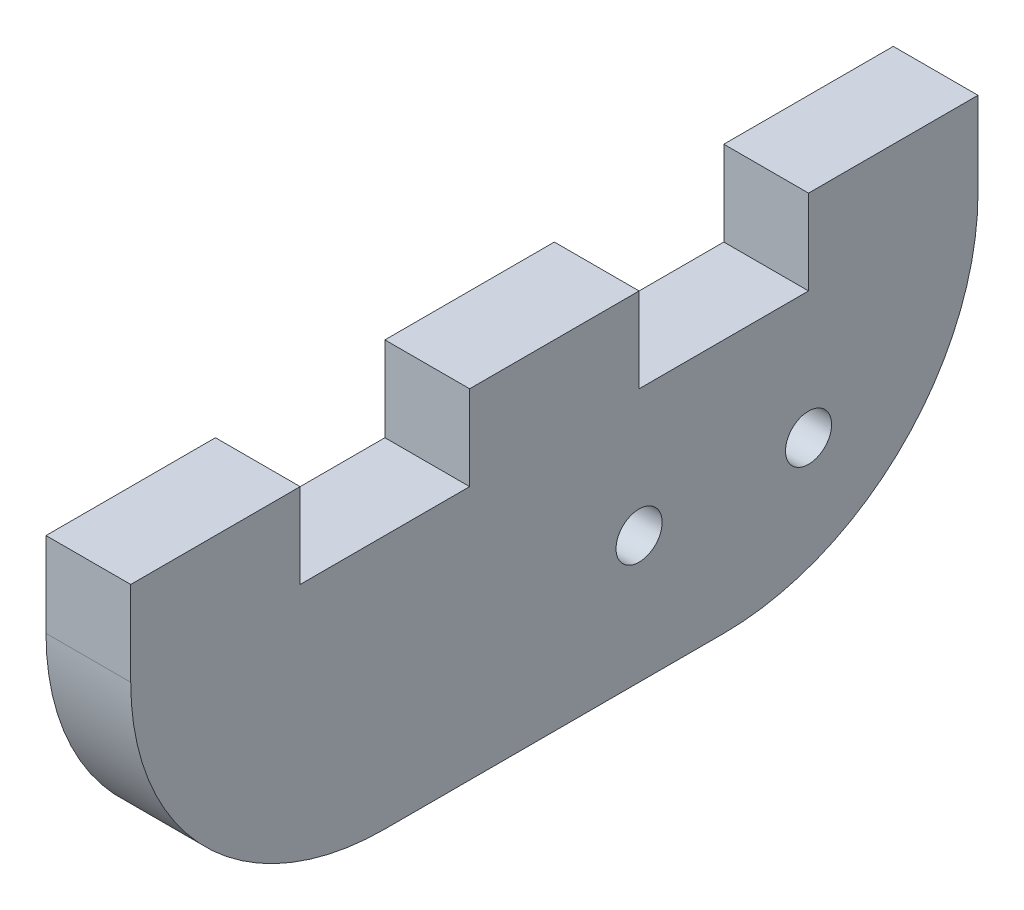
ISO-10303-21;
HEADER;
FILE_DESCRIPTION(('STEP AP214'),'2;1');
FILE_NAME('part.step','',(''),(''),'','','');
FILE_SCHEMA(('AUTOMOTIVE_DESIGN { 1 0 10303 214 1 1 1 1 }'));
ENDSEC;
DATA;
#1=APPLICATION_CONTEXT('core data for automotive mechanical design processes');
#2=APPLICATION_PROTOCOL_DEFINITION('international standard','automotive_design',2000,#1);
#3=PRODUCT_CONTEXT('',#1,'mechanical');
#4=PRODUCT('Part','Part','',(#3));
#5=PRODUCT_RELATED_PRODUCT_CATEGORY('part','',(#4));
#6=PRODUCT_DEFINITION_FORMATION('','',#4);
#7=PRODUCT_DEFINITION_CONTEXT('part definition',#1,'design');
#8=PRODUCT_DEFINITION('design','',#6,#7);
#9=PRODUCT_DEFINITION_SHAPE('','',#8);
#10=(LENGTH_UNIT() NAMED_UNIT(*) SI_UNIT(.MILLI.,.METRE.));
#11=(NAMED_UNIT(*) PLANE_ANGLE_UNIT() SI_UNIT($,.RADIAN.));
#12=(NAMED_UNIT(*) SI_UNIT($,.STERADIAN.) SOLID_ANGLE_UNIT());
#13=UNCERTAINTY_MEASURE_WITH_UNIT(LENGTH_MEASURE(1.E-05),#10,'distance_accuracy_value','');
#14=(GEOMETRIC_REPRESENTATION_CONTEXT(3) GLOBAL_UNCERTAINTY_ASSIGNED_CONTEXT((#13)) GLOBAL_UNIT_ASSIGNED_CONTEXT((#10,
#11,#12)) REPRESENTATION_CONTEXT('',''));
#15=CARTESIAN_POINT('',(0.,0.,0.));
#16=DIRECTION('',(0.,0.,1.));
#17=DIRECTION('',(1.,0.,0.));
#18=AXIS2_PLACEMENT_3D('',#15,#16,#17);
#19=CARTESIAN_POINT('',(3.175,0.,0.));
#20=DIRECTION('',(0.,0.,1.));
#21=DIRECTION('',(1.,0.,0.));
#22=AXIS2_PLACEMENT_3D('',#19,#20,#21);
#23=PLANE('',#22);
#24=DIRECTION('',(0.,1.,0.));
#25=VECTOR('',#24,1.);
#26=CARTESIAN_POINT('',(3.175,-19.05,0.));
#27=LINE('',#26,#25);
#28=CARTESIAN_POINT('',(3.175,0.,0.));
#29=VERTEX_POINT('',#28);
#30=CARTESIAN_POINT('',(3.175,6.35,0.));
#31=VERTEX_POINT('',#30);
#32=EDGE_CURVE('E137',#29,#31,#27,.T.);
#33=ORIENTED_EDGE('',*,*,#32,.F.);
#34=DIRECTION('',(-1.,0.,0.));
#35=VECTOR('',#34,1.);
#36=CARTESIAN_POINT('',(3.175,0.,0.));
#37=LINE('',#36,#35);
#38=CARTESIAN_POINT('',(-3.175,0.,0.));
#39=VERTEX_POINT('',#38);
#40=EDGE_CURVE('E155',#29,#39,#37,.T.);
#41=ORIENTED_EDGE('',*,*,#40,.T.);
#42=DIRECTION('',(0.,1.,0.));
#43=VECTOR('',#42,1.);
#44=CARTESIAN_POINT('',(-3.175,0.,0.));
#45=LINE('',#44,#43);
#46=CARTESIAN_POINT('',(-3.175,6.35,0.));
#47=VERTEX_POINT('',#46);
#48=EDGE_CURVE('E152',#39,#47,#45,.T.);
#49=ORIENTED_EDGE('',*,*,#48,.T.);
#50=DIRECTION('',(-1.,0.,0.));
#51=VECTOR('',#50,1.);
#52=CARTESIAN_POINT('',(3.175,6.35,0.));
#53=LINE('',#52,#51);
#54=EDGE_CURVE('E150',#31,#47,#53,.T.);
#55=ORIENTED_EDGE('',*,*,#54,.F.);
#56=EDGE_LOOP('',(#33,#41,#49,#55));
#57=FACE_BOUND('',#56,.T.);
#58=ADVANCED_FACE('F35',(#57),#23,.F.);
#59=CARTESIAN_POINT('',(3.175,6.35,0.));
#60=DIRECTION('',(0.,-1.,0.));
#61=DIRECTION('',(0.,0.,-1.));
#62=AXIS2_PLACEMENT_3D('',#59,#60,#61);
#63=PLANE('',#62);
#64=DIRECTION('',(0.,0.,1.));
#65=VECTOR('',#64,1.);
#66=CARTESIAN_POINT('',(-3.175,6.35,0.));
#67=LINE('',#66,#65);
#68=CARTESIAN_POINT('',(-3.175,6.35,12.7));
#69=VERTEX_POINT('',#68);
#70=EDGE_CURVE('E186',#47,#69,#67,.T.);
#71=ORIENTED_EDGE('',*,*,#70,.T.);
#72=DIRECTION('',(-1.,0.,0.));
#73=VECTOR('',#72,1.);
#74=CARTESIAN_POINT('',(3.175,6.35,12.7));
#75=LINE('',#74,#73);
#76=CARTESIAN_POINT('',(3.175,6.35,12.7));
#77=VERTEX_POINT('',#76);
#78=EDGE_CURVE('E156',#77,#69,#75,.T.);
#79=ORIENTED_EDGE('',*,*,#78,.F.);
#80=DIRECTION('',(0.,0.,1.));
#81=VECTOR('',#80,1.);
#82=CARTESIAN_POINT('',(3.175,6.35,0.));
#83=LINE('',#82,#81);
#84=EDGE_CURVE('E141',#31,#77,#83,.T.);
#85=ORIENTED_EDGE('',*,*,#84,.F.);
#86=ORIENTED_EDGE('',*,*,#54,.T.);
#87=EDGE_LOOP('',(#71,#79,#85,#86));
#88=FACE_BOUND('',#87,.T.);
#89=ADVANCED_FACE('F158',(#88),#63,.F.);
#90=CARTESIAN_POINT('',(3.175,6.35,12.7));
#91=DIRECTION('',(0.,0.,-1.));
#92=DIRECTION('',(-1.,0.,0.));
#93=AXIS2_PLACEMENT_3D('',#90,#91,#92);
#94=PLANE('',#93);
#95=DIRECTION('',(0.,-1.,0.));
#96=VECTOR('',#95,1.);
#97=CARTESIAN_POINT('',(-3.175,6.35,12.7));
#98=LINE('',#97,#96);
#99=CARTESIAN_POINT('',(-3.175,0.,12.7));
#100=VERTEX_POINT('',#99);
#101=EDGE_CURVE('E189',#69,#100,#98,.T.);
#102=ORIENTED_EDGE('',*,*,#101,.T.);
#103=DIRECTION('',(-1.,0.,0.));
#104=VECTOR('',#103,1.);
#105=CARTESIAN_POINT('',(3.175,0.,12.7));
#106=LINE('',#105,#104);
#107=CARTESIAN_POINT('',(3.175,0.,12.7));
#108=VERTEX_POINT('',#107);
#109=EDGE_CURVE('E228',#108,#100,#106,.T.);
#110=ORIENTED_EDGE('',*,*,#109,.F.);
#111=DIRECTION('',(0.,-1.,0.));
#112=VECTOR('',#111,1.);
#113=CARTESIAN_POINT('',(3.175,6.35,12.7));
#114=LINE('',#113,#112);
#115=EDGE_CURVE('E161',#77,#108,#114,.T.);
#116=ORIENTED_EDGE('',*,*,#115,.F.);
#117=ORIENTED_EDGE('',*,*,#78,.T.);
#118=EDGE_LOOP('',(#102,#110,#116,#117));
#119=FACE_BOUND('',#118,.T.);
#120=ADVANCED_FACE('F289',(#119),#94,.F.);
#121=CARTESIAN_POINT('',(3.175,0.,12.7));
#122=DIRECTION('',(0.,-1.,0.));
#123=DIRECTION('',(0.,0.,-1.));
#124=AXIS2_PLACEMENT_3D('',#121,#122,#123);
#125=PLANE('',#124);
#126=DIRECTION('',(0.,0.,1.));
#127=VECTOR('',#126,1.);
#128=CARTESIAN_POINT('',(-3.175,0.,12.7));
#129=LINE('',#128,#127);
#130=CARTESIAN_POINT('',(-3.175,0.,25.4));
#131=VERTEX_POINT('',#130);
#132=EDGE_CURVE('E191',#100,#131,#129,.T.);
#133=ORIENTED_EDGE('',*,*,#132,.T.);
#134=DIRECTION('',(-1.,0.,0.));
#135=VECTOR('',#134,1.);
#136=CARTESIAN_POINT('',(3.175,0.,25.4));
#137=LINE('',#136,#135);
#138=CARTESIAN_POINT('',(3.175,0.,25.4));
#139=VERTEX_POINT('',#138);
#140=EDGE_CURVE('E225',#139,#131,#137,.T.);
#141=ORIENTED_EDGE('',*,*,#140,.F.);
#142=DIRECTION('',(0.,0.,1.));
#143=VECTOR('',#142,1.);
#144=CARTESIAN_POINT('',(3.175,0.,12.7));
#145=LINE('',#144,#143);
#146=EDGE_CURVE('E163',#108,#139,#145,.T.);
#147=ORIENTED_EDGE('',*,*,#146,.F.);
#148=ORIENTED_EDGE('',*,*,#109,.T.);
#149=EDGE_LOOP('',(#133,#141,#147,#148));
#150=FACE_BOUND('',#149,.T.);
#151=ADVANCED_FACE('F285',(#150),#125,.F.);
#152=CARTESIAN_POINT('',(3.175,0.,25.4));
#153=DIRECTION('',(0.,0.,1.));
#154=DIRECTION('',(1.,0.,0.));
#155=AXIS2_PLACEMENT_3D('',#152,#153,#154);
#156=PLANE('',#155);
#157=DIRECTION('',(0.,1.,0.));
#158=VECTOR('',#157,1.);
#159=CARTESIAN_POINT('',(-3.175,0.,25.4));
#160=LINE('',#159,#158);
#161=CARTESIAN_POINT('',(-3.175,6.35,25.4));
#162=VERTEX_POINT('',#161);
#163=EDGE_CURVE('E193',#131,#162,#160,.T.);
#164=ORIENTED_EDGE('',*,*,#163,.T.);
#165=DIRECTION('',(-1.,0.,0.));
#166=VECTOR('',#165,1.);
#167=CARTESIAN_POINT('',(3.175,6.35,25.4));
#168=LINE('',#167,#166);
#169=CARTESIAN_POINT('',(3.175,6.35,25.4));
#170=VERTEX_POINT('',#169);
#171=EDGE_CURVE('E222',#170,#162,#168,.T.);
#172=ORIENTED_EDGE('',*,*,#171,.F.);
#173=DIRECTION('',(0.,1.,0.));
#174=VECTOR('',#173,1.);
#175=CARTESIAN_POINT('',(3.175,0.,25.4));
#176=LINE('',#175,#174);
#177=EDGE_CURVE('E168',#139,#170,#176,.T.);
#178=ORIENTED_EDGE('',*,*,#177,.F.);
#179=ORIENTED_EDGE('',*,*,#140,.T.);
#180=EDGE_LOOP('',(#164,#172,#178,#179));
#181=FACE_BOUND('',#180,.T.);
#182=ADVANCED_FACE('F281',(#181),#156,.F.);
#183=CARTESIAN_POINT('',(3.175,6.35,25.4));
#184=DIRECTION('',(0.,-1.,0.));
#185=DIRECTION('',(0.,0.,-1.));
#186=AXIS2_PLACEMENT_3D('',#183,#184,#185);
#187=PLANE('',#186);
#188=DIRECTION('',(0.,0.,1.));
#189=VECTOR('',#188,1.);
#190=CARTESIAN_POINT('',(-3.175,6.35,25.4));
#191=LINE('',#190,#189);
#192=CARTESIAN_POINT('',(-3.175,6.35,38.1));
#193=VERTEX_POINT('',#192);
#194=EDGE_CURVE('E195',#162,#193,#191,.T.);
#195=ORIENTED_EDGE('',*,*,#194,.T.);
#196=DIRECTION('',(-1.,0.,0.));
#197=VECTOR('',#196,1.);
#198=CARTESIAN_POINT('',(3.175,6.35,38.1));
#199=LINE('',#198,#197);
#200=CARTESIAN_POINT('',(3.175,6.35,38.1));
#201=VERTEX_POINT('',#200);
#202=EDGE_CURVE('E219',#201,#193,#199,.T.);
#203=ORIENTED_EDGE('',*,*,#202,.F.);
#204=DIRECTION('',(0.,0.,1.));
#205=VECTOR('',#204,1.);
#206=CARTESIAN_POINT('',(3.175,6.35,25.4));
#207=LINE('',#206,#205);
#208=EDGE_CURVE('E170',#170,#201,#207,.T.);
#209=ORIENTED_EDGE('',*,*,#208,.F.);
#210=ORIENTED_EDGE('',*,*,#171,.T.);
#211=EDGE_LOOP('',(#195,#203,#209,#210));
#212=FACE_BOUND('',#211,.T.);
#213=ADVANCED_FACE('F276',(#212),#187,.F.);
#214=CARTESIAN_POINT('',(3.175,6.35,38.1));
#215=DIRECTION('',(0.,0.,-1.));
#216=DIRECTION('',(-1.,0.,0.));
#217=AXIS2_PLACEMENT_3D('',#214,#215,#216);
#218=PLANE('',#217);
#219=DIRECTION('',(0.,-1.,0.));
#220=VECTOR('',#219,1.);
#221=CARTESIAN_POINT('',(-3.175,6.35,38.1));
#222=LINE('',#221,#220);
#223=CARTESIAN_POINT('',(-3.175,0.,38.1));
#224=VERTEX_POINT('',#223);
#225=EDGE_CURVE('E197',#193,#224,#222,.T.);
#226=ORIENTED_EDGE('',*,*,#225,.T.);
#227=DIRECTION('',(-1.,0.,0.));
#228=VECTOR('',#227,1.);
#229=CARTESIAN_POINT('',(3.175,0.,38.1));
#230=LINE('',#229,#228);
#231=CARTESIAN_POINT('',(3.175,0.,38.1));
#232=VERTEX_POINT('',#231);
#233=EDGE_CURVE('E216',#232,#224,#230,.T.);
#234=ORIENTED_EDGE('',*,*,#233,.F.);
#235=DIRECTION('',(0.,-1.,0.));
#236=VECTOR('',#235,1.);
#237=CARTESIAN_POINT('',(3.175,6.35,38.1));
#238=LINE('',#237,#236);
#239=EDGE_CURVE('E172',#201,#232,#238,.T.);
#240=ORIENTED_EDGE('',*,*,#239,.F.);
#241=ORIENTED_EDGE('',*,*,#202,.T.);
#242=EDGE_LOOP('',(#226,#234,#240,#241));
#243=FACE_BOUND('',#242,.T.);
#244=ADVANCED_FACE('F270',(#243),#218,.F.);
#245=CARTESIAN_POINT('',(3.175,0.,38.1));
#246=DIRECTION('',(0.,-1.,0.));
#247=DIRECTION('',(0.,0.,-1.));
#248=AXIS2_PLACEMENT_3D('',#245,#246,#247);
#249=PLANE('',#248);
#250=DIRECTION('',(0.,0.,1.));
#251=VECTOR('',#250,1.);
#252=CARTESIAN_POINT('',(-3.175,0.,38.1));
#253=LINE('',#252,#251);
#254=CARTESIAN_POINT('',(-3.175,0.,50.8));
#255=VERTEX_POINT('',#254);
#256=EDGE_CURVE('E199',#224,#255,#253,.T.);
#257=ORIENTED_EDGE('',*,*,#256,.T.);
#258=DIRECTION('',(-1.,0.,0.));
#259=VECTOR('',#258,1.);
#260=CARTESIAN_POINT('',(3.175,0.,50.8));
#261=LINE('',#260,#259);
#262=CARTESIAN_POINT('',(3.175,0.,50.8));
#263=VERTEX_POINT('',#262);
#264=EDGE_CURVE('E213',#263,#255,#261,.T.);
#265=ORIENTED_EDGE('',*,*,#264,.F.);
#266=DIRECTION('',(0.,0.,1.));
#267=VECTOR('',#266,1.);
#268=CARTESIAN_POINT('',(3.175,0.,38.1));
#269=LINE('',#268,#267);
#270=EDGE_CURVE('E174',#232,#263,#269,.T.);
#271=ORIENTED_EDGE('',*,*,#270,.F.);
#272=ORIENTED_EDGE('',*,*,#233,.T.);
#273=EDGE_LOOP('',(#257,#265,#271,#272));
#274=FACE_BOUND('',#273,.T.);
#275=ADVANCED_FACE('F266',(#274),#249,.F.);
#276=CARTESIAN_POINT('',(3.175,0.,50.8));
#277=DIRECTION('',(0.,0.,1.));
#278=DIRECTION('',(1.,0.,0.));
#279=AXIS2_PLACEMENT_3D('',#276,#277,#278);
#280=PLANE('',#279);
#281=DIRECTION('',(0.,1.,0.));
#282=VECTOR('',#281,1.);
#283=CARTESIAN_POINT('',(-3.175,0.,50.8));
#284=LINE('',#283,#282);
#285=CARTESIAN_POINT('',(-3.175,6.34999999999999,50.8));
#286=VERTEX_POINT('',#285);
#287=EDGE_CURVE('E201',#255,#286,#284,.T.);
#288=ORIENTED_EDGE('',*,*,#287,.T.);
#289=DIRECTION('',(-1.,0.,0.));
#290=VECTOR('',#289,1.);
#291=CARTESIAN_POINT('',(3.175,6.34999999999999,50.8));
#292=LINE('',#291,#290);
#293=CARTESIAN_POINT('',(3.175,6.34999999999999,50.8));
#294=VERTEX_POINT('',#293);
#295=EDGE_CURVE('E210',#294,#286,#292,.T.);
#296=ORIENTED_EDGE('',*,*,#295,.F.);
#297=DIRECTION('',(0.,1.,0.));
#298=VECTOR('',#297,1.);
#299=CARTESIAN_POINT('',(3.175,0.,50.8));
#300=LINE('',#299,#298);
#301=EDGE_CURVE('E176',#263,#294,#300,.T.);
#302=ORIENTED_EDGE('',*,*,#301,.F.);
#303=ORIENTED_EDGE('',*,*,#264,.T.);
#304=EDGE_LOOP('',(#288,#296,#302,#303));
#305=FACE_BOUND('',#304,.T.);
#306=ADVANCED_FACE('F261',(#305),#280,.F.);
#307=CARTESIAN_POINT('',(3.175,6.34999999999999,50.8));
#308=DIRECTION('',(0.,-1.,0.));
#309=DIRECTION('',(0.,0.,-1.));
#310=AXIS2_PLACEMENT_3D('',#307,#308,#309);
#311=PLANE('',#310);
#312=DIRECTION('',(0.,0.,1.));
#313=VECTOR('',#312,1.);
#314=CARTESIAN_POINT('',(-3.175,6.34999999999999,50.8));
#315=LINE('',#314,#313);
#316=CARTESIAN_POINT('',(-3.175,6.34999999999999,63.5));
#317=VERTEX_POINT('',#316);
#318=EDGE_CURVE('E203',#286,#317,#315,.T.);
#319=ORIENTED_EDGE('',*,*,#318,.T.);
#320=DIRECTION('',(-1.,0.,0.));
#321=VECTOR('',#320,1.);
#322=CARTESIAN_POINT('',(3.175,6.34999999999999,63.5));
#323=LINE('',#322,#321);
#324=CARTESIAN_POINT('',(3.175,6.34999999999999,63.5));
#325=VERTEX_POINT('',#324);
#326=EDGE_CURVE('E184',#325,#317,#323,.T.);
#327=ORIENTED_EDGE('',*,*,#326,.F.);
#328=DIRECTION('',(0.,0.,1.));
#329=VECTOR('',#328,1.);
#330=CARTESIAN_POINT('',(3.175,6.34999999999999,50.8));
#331=LINE('',#330,#329);
#332=EDGE_CURVE('E178',#294,#325,#331,.T.);
#333=ORIENTED_EDGE('',*,*,#332,.F.);
#334=ORIENTED_EDGE('',*,*,#295,.T.);
#335=EDGE_LOOP('',(#319,#327,#333,#334));
#336=FACE_BOUND('',#335,.T.);
#337=ADVANCED_FACE('F255',(#336),#311,.F.);
#338=CARTESIAN_POINT('',(3.175,6.34999999999999,63.5));
#339=DIRECTION('',(0.,0.,-1.));
#340=DIRECTION('',(-1.,0.,0.));
#341=AXIS2_PLACEMENT_3D('',#338,#339,#340);
#342=PLANE('',#341);
#343=DIRECTION('',(0.,-1.,0.));
#344=VECTOR('',#343,1.);
#345=CARTESIAN_POINT('',(-3.175,6.34999999999999,63.5));
#346=LINE('',#345,#344);
#347=CARTESIAN_POINT('',(-3.175,0.,63.5));
#348=VERTEX_POINT('',#347);
#349=EDGE_CURVE('E205',#317,#348,#346,.T.);
#350=ORIENTED_EDGE('',*,*,#349,.T.);
#351=DIRECTION('',(-1.,0.,0.));
#352=VECTOR('',#351,1.);
#353=CARTESIAN_POINT('',(3.175,0.,63.5));
#354=LINE('',#353,#352);
#355=CARTESIAN_POINT('',(3.175,0.,63.5));
#356=VERTEX_POINT('',#355);
#357=EDGE_CURVE('E11',#348,#356,#354,.F.);
#358=ORIENTED_EDGE('',*,*,#357,.T.);
#359=DIRECTION('',(0.,-1.,0.));
#360=VECTOR('',#359,1.);
#361=CARTESIAN_POINT('',(3.175,6.34999999999999,63.5));
#362=LINE('',#361,#360);
#363=EDGE_CURVE('E180',#325,#356,#362,.T.);
#364=ORIENTED_EDGE('',*,*,#363,.F.);
#365=ORIENTED_EDGE('',*,*,#326,.T.);
#366=EDGE_LOOP('',(#350,#358,#364,#365));
#367=FACE_BOUND('',#366,.T.);
#368=ADVANCED_FACE('F251',(#367),#342,.F.);
#369=CARTESIAN_POINT('',(3.175,-19.05,63.5));
#370=DIRECTION('',(0.,1.,0.));
#371=DIRECTION('',(0.,0.,1.));
#372=AXIS2_PLACEMENT_3D('',#369,#370,#371);
#373=PLANE('',#372);
#374=DIRECTION('',(0.,0.,-1.));
#375=VECTOR('',#374,1.);
#376=CARTESIAN_POINT('',(-3.175,-19.05,63.5));
#377=LINE('',#376,#375);
#378=CARTESIAN_POINT('',(-3.175,-19.05,44.45));
#379=VERTEX_POINT('',#378);
#380=CARTESIAN_POINT('',(-3.175,-19.05,19.05));
#381=VERTEX_POINT('',#380);
#382=EDGE_CURVE('E147',#379,#381,#377,.T.);
#383=ORIENTED_EDGE('',*,*,#382,.T.);
#384=DIRECTION('',(-1.,0.,0.));
#385=VECTOR('',#384,1.);
#386=CARTESIAN_POINT('',(3.175,-19.05,19.05));
#387=LINE('',#386,#385);
#388=CARTESIAN_POINT('',(3.175,-19.05,19.05));
#389=VERTEX_POINT('',#388);
#390=EDGE_CURVE('E56',#381,#389,#387,.F.);
#391=ORIENTED_EDGE('',*,*,#390,.T.);
#392=DIRECTION('',(0.,0.,-1.));
#393=VECTOR('',#392,1.);
#394=CARTESIAN_POINT('',(3.175,-19.05,63.5));
#395=LINE('',#394,#393);
#396=CARTESIAN_POINT('',(3.175,-19.05,44.45));
#397=VERTEX_POINT('',#396);
#398=EDGE_CURVE('E182',#397,#389,#395,.T.);
#399=ORIENTED_EDGE('',*,*,#398,.F.);
#400=DIRECTION('',(-1.,0.,0.));
#401=VECTOR('',#400,1.);
#402=CARTESIAN_POINT('',(3.175,-19.05,44.45));
#403=LINE('',#402,#401);
#404=EDGE_CURVE('E237',#397,#379,#403,.T.);
#405=ORIENTED_EDGE('',*,*,#404,.T.);
#406=EDGE_LOOP('',(#383,#391,#399,#405));
#407=FACE_BOUND('',#406,.T.);
#408=ADVANCED_FACE('F245',(#407),#373,.F.);
#409=CARTESIAN_POINT('',(3.175,0.,0.));
#410=DIRECTION('',(1.,0.,0.));
#411=DIRECTION('',(0.,0.,-1.));
#412=AXIS2_PLACEMENT_3D('',#409,#410,#411);
#413=PLANE('',#412);
#414=CARTESIAN_POINT('',(3.175,-9.525,12.7));
#415=DIRECTION('',(1.,0.,0.));
#416=DIRECTION('',(0.,0.,-1.));
#417=AXIS2_PLACEMENT_3D('',#414,#415,#416);
#418=CIRCLE('',#417,1.72719999999999);
#419=CARTESIAN_POINT('',(3.175,-9.525,10.9728));
#420=VERTEX_POINT('',#419);
#421=EDGE_CURVE('E459',#420,#420,#418,.T.);
#422=ORIENTED_EDGE('',*,*,#421,.F.);
#423=EDGE_LOOP('',(#422));
#424=FACE_BOUND('',#423,.T.);
#425=CARTESIAN_POINT('',(3.175,-9.52500000000001,25.4));
#426=DIRECTION('',(1.,0.,0.));
#427=DIRECTION('',(0.,0.,-1.));
#428=AXIS2_PLACEMENT_3D('',#425,#426,#427);
#429=CIRCLE('',#428,1.72719999999999);
#430=CARTESIAN_POINT('',(3.175,-9.52500000000001,23.6728));
#431=VERTEX_POINT('',#430);
#432=EDGE_CURVE('E454',#431,#431,#429,.T.);
#433=ORIENTED_EDGE('',*,*,#432,.F.);
#434=EDGE_LOOP('',(#433));
#435=FACE_BOUND('',#434,.T.);
#436=ORIENTED_EDGE('',*,*,#398,.T.);
#437=CARTESIAN_POINT('',(3.175,0.,19.05));
#438=DIRECTION('',(1.,0.,0.));
#439=DIRECTION('',(0.,0.,-1.));
#440=AXIS2_PLACEMENT_3D('',#437,#438,#439);
#441=CIRCLE('',#440,19.05);
#442=EDGE_CURVE('E43',#389,#29,#441,.T.);
#443=ORIENTED_EDGE('',*,*,#442,.T.);
#444=ORIENTED_EDGE('',*,*,#32,.T.);
#445=ORIENTED_EDGE('',*,*,#84,.T.);
#446=ORIENTED_EDGE('',*,*,#115,.T.);
#447=ORIENTED_EDGE('',*,*,#146,.T.);
#448=ORIENTED_EDGE('',*,*,#177,.T.);
#449=ORIENTED_EDGE('',*,*,#208,.T.);
#450=ORIENTED_EDGE('',*,*,#239,.T.);
#451=ORIENTED_EDGE('',*,*,#270,.T.);
#452=ORIENTED_EDGE('',*,*,#301,.T.);
#453=ORIENTED_EDGE('',*,*,#332,.T.);
#454=ORIENTED_EDGE('',*,*,#363,.T.);
#455=CARTESIAN_POINT('',(3.175,0.,44.45));
#456=DIRECTION('',(1.,0.,0.));
#457=DIRECTION('',(0.,0.,-1.));
#458=AXIS2_PLACEMENT_3D('',#455,#456,#457);
#459=CIRCLE('',#458,19.05);
#460=EDGE_CURVE('E241',#356,#397,#459,.T.);
#461=ORIENTED_EDGE('',*,*,#460,.T.);
#462=EDGE_LOOP('',(#436,#443,#444,#445,#446,#447,#448,#449,#450,#451,#452,#453,#454,#461));
#463=FACE_BOUND('',#462,.T.);
#464=ADVANCED_FACE('F139',(#424,#435,#463),#413,.T.);
#465=CARTESIAN_POINT('',(-3.175,0.,0.));
#466=DIRECTION('',(1.,0.,0.));
#467=DIRECTION('',(0.,0.,-1.));
#468=AXIS2_PLACEMENT_3D('',#465,#466,#467);
#469=PLANE('',#468);
#470=CARTESIAN_POINT('',(-3.175,-9.525,12.7));
#471=DIRECTION('',(1.,0.,0.));
#472=DIRECTION('',(0.,0.,-1.));
#473=AXIS2_PLACEMENT_3D('',#470,#471,#472);
#474=CIRCLE('',#473,1.7272);
#475=CARTESIAN_POINT('',(-3.175,-9.525,10.9728));
#476=VERTEX_POINT('',#475);
#477=EDGE_CURVE('E451',#476,#476,#474,.T.);
#478=ORIENTED_EDGE('',*,*,#477,.T.);
#479=EDGE_LOOP('',(#478));
#480=FACE_BOUND('',#479,.T.);
#481=CARTESIAN_POINT('',(-3.175,-9.52500000000001,25.4));
#482=DIRECTION('',(1.,0.,0.));
#483=DIRECTION('',(0.,0.,-1.));
#484=AXIS2_PLACEMENT_3D('',#481,#482,#483);
#485=CIRCLE('',#484,1.7272);
#486=CARTESIAN_POINT('',(-3.175,-9.52500000000001,23.6728));
#487=VERTEX_POINT('',#486);
#488=EDGE_CURVE('E187',#487,#487,#485,.T.);
#489=ORIENTED_EDGE('',*,*,#488,.T.);
#490=EDGE_LOOP('',(#489));
#491=FACE_BOUND('',#490,.T.);
#492=ORIENTED_EDGE('',*,*,#48,.F.);
#493=CARTESIAN_POINT('',(-3.175,0.,19.05));
#494=DIRECTION('',(1.,0.,0.));
#495=DIRECTION('',(0.,0.,-1.));
#496=AXIS2_PLACEMENT_3D('',#493,#494,#495);
#497=CIRCLE('',#496,19.05);
#498=EDGE_CURVE('E235',#39,#381,#497,.F.);
#499=ORIENTED_EDGE('',*,*,#498,.T.);
#500=ORIENTED_EDGE('',*,*,#382,.F.);
#501=CARTESIAN_POINT('',(-3.175,0.,44.45));
#502=DIRECTION('',(1.,0.,0.));
#503=DIRECTION('',(0.,0.,-1.));
#504=AXIS2_PLACEMENT_3D('',#501,#502,#503);
#505=CIRCLE('',#504,19.05);
#506=EDGE_CURVE('E233',#379,#348,#505,.F.);
#507=ORIENTED_EDGE('',*,*,#506,.T.);
#508=ORIENTED_EDGE('',*,*,#349,.F.);
#509=ORIENTED_EDGE('',*,*,#318,.F.);
#510=ORIENTED_EDGE('',*,*,#287,.F.);
#511=ORIENTED_EDGE('',*,*,#256,.F.);
#512=ORIENTED_EDGE('',*,*,#225,.F.);
#513=ORIENTED_EDGE('',*,*,#194,.F.);
#514=ORIENTED_EDGE('',*,*,#163,.F.);
#515=ORIENTED_EDGE('',*,*,#132,.F.);
#516=ORIENTED_EDGE('',*,*,#101,.F.);
#517=ORIENTED_EDGE('',*,*,#70,.F.);
#518=EDGE_LOOP('',(#492,#499,#500,#507,#508,#509,#510,#511,#512,#513,#514,#515,#516,#517));
#519=FACE_BOUND('',#518,.T.);
#520=ADVANCED_FACE('F249',(#480,#491,#519),#469,.F.);
#521=CARTESIAN_POINT('',(3.175,-9.52500000000001,25.4));
#522=DIRECTION('',(1.,0.,0.));
#523=DIRECTION('',(0.,0.,-1.));
#524=AXIS2_PLACEMENT_3D('',#521,#522,#523);
#525=CYLINDRICAL_SURFACE('',#524,1.72719999999999);
#526=ORIENTED_EDGE('',*,*,#488,.F.);
#527=EDGE_LOOP('',(#526));
#528=FACE_BOUND('',#527,.T.);
#529=ORIENTED_EDGE('',*,*,#432,.T.);
#530=EDGE_LOOP('',(#529));
#531=FACE_BOUND('',#530,.T.);
#532=ADVANCED_FACE('F310',(#528,#531),#525,.F.);
#533=CARTESIAN_POINT('',(3.175,-9.525,12.7));
#534=DIRECTION('',(1.,0.,0.));
#535=DIRECTION('',(0.,0.,-1.));
#536=AXIS2_PLACEMENT_3D('',#533,#534,#535);
#537=CYLINDRICAL_SURFACE('',#536,1.72719999999999);
#538=ORIENTED_EDGE('',*,*,#477,.F.);
#539=EDGE_LOOP('',(#538));
#540=FACE_BOUND('',#539,.T.);
#541=ORIENTED_EDGE('',*,*,#421,.T.);
#542=EDGE_LOOP('',(#541));
#543=FACE_BOUND('',#542,.T.);
#544=ADVANCED_FACE('F304',(#540,#543),#537,.F.);
#545=CARTESIAN_POINT('',(3.175,0.,19.05));
#546=DIRECTION('',(-1.,0.,0.));
#547=DIRECTION('',(0.,0.,1.));
#548=AXIS2_PLACEMENT_3D('',#545,#546,#547);
#549=CYLINDRICAL_SURFACE('',#548,19.05);
#550=ORIENTED_EDGE('',*,*,#442,.F.);
#551=ORIENTED_EDGE('',*,*,#390,.F.);
#552=ORIENTED_EDGE('',*,*,#498,.F.);
#553=ORIENTED_EDGE('',*,*,#40,.F.);
#554=EDGE_LOOP('',(#550,#551,#552,#553));
#555=FACE_BOUND('',#554,.T.);
#556=ADVANCED_FACE('F302',(#555),#549,.T.);
#557=CARTESIAN_POINT('',(3.175,0.,44.45));
#558=DIRECTION('',(-1.,0.,0.));
#559=DIRECTION('',(0.,0.,1.));
#560=AXIS2_PLACEMENT_3D('',#557,#558,#559);
#561=CYLINDRICAL_SURFACE('',#560,19.05);
#562=ORIENTED_EDGE('',*,*,#460,.F.);
#563=ORIENTED_EDGE('',*,*,#357,.F.);
#564=ORIENTED_EDGE('',*,*,#506,.F.);
#565=ORIENTED_EDGE('',*,*,#404,.F.);
#566=EDGE_LOOP('',(#562,#563,#564,#565));
#567=FACE_BOUND('',#566,.T.);
#568=ADVANCED_FACE('F37',(#567),#561,.T.);
#569=CLOSED_SHELL('',(#58,#89,#120,#151,#182,#213,#244,#275,#306,#337,#368,#408,#464,#520,#532,
#544,#556,#568));
#570=MANIFOLD_SOLID_BREP('B2',#569);
#571=ADVANCED_BREP_SHAPE_REPRESENTATION('',(#18,#570),#14);
#572=SHAPE_DEFINITION_REPRESENTATION(#9,#571);
ENDSEC;
END-ISO-10303-21;
